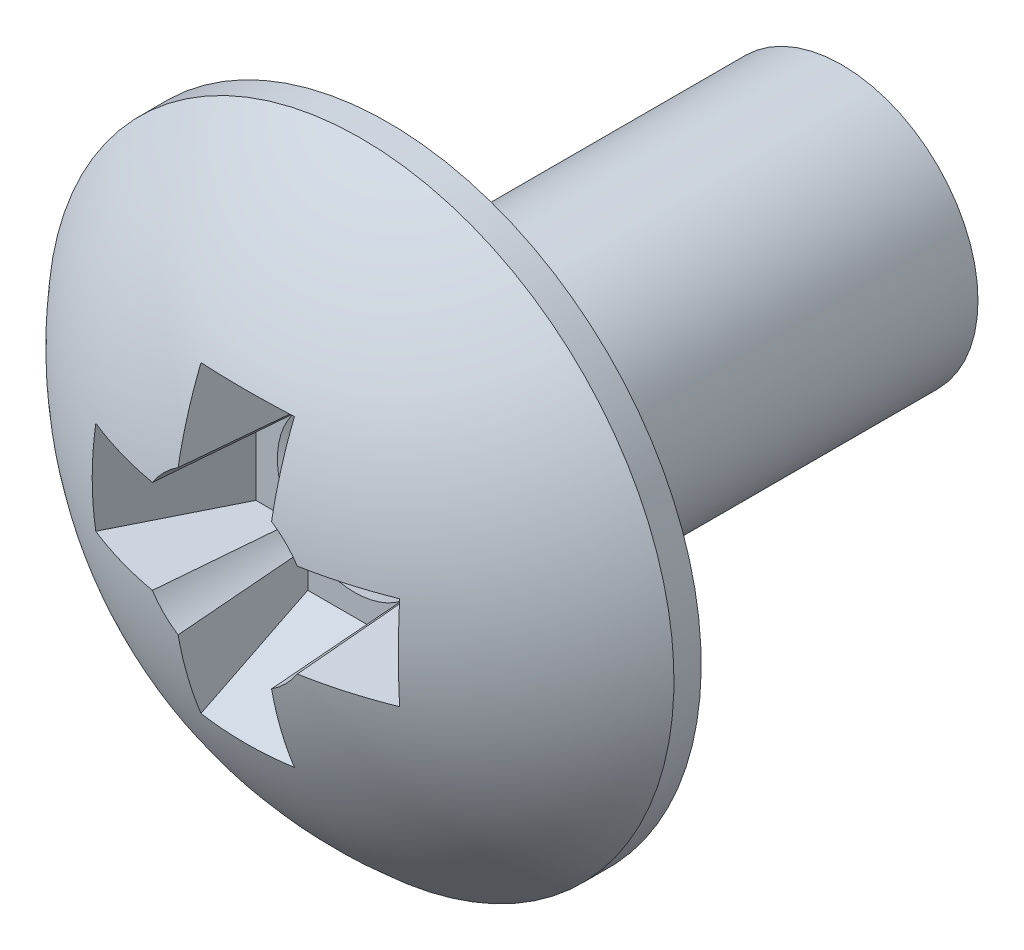
ISO-10303-21;
HEADER;
FILE_DESCRIPTION(('STEP AP214'),'2;1');
FILE_NAME('part.step','',(''),(''),'','','');
FILE_SCHEMA(('AUTOMOTIVE_DESIGN { 1 0 10303 214 1 1 1 1 }'));
ENDSEC;
DATA;
#1=APPLICATION_CONTEXT('core data for automotive mechanical design processes');
#2=APPLICATION_PROTOCOL_DEFINITION('international standard','automotive_design',2000,#1);
#3=PRODUCT_CONTEXT('',#1,'mechanical');
#4=PRODUCT('Part','Part','',(#3));
#5=PRODUCT_RELATED_PRODUCT_CATEGORY('part','',(#4));
#6=PRODUCT_DEFINITION_FORMATION('','',#4);
#7=PRODUCT_DEFINITION_CONTEXT('part definition',#1,'design');
#8=PRODUCT_DEFINITION('design','',#6,#7);
#9=PRODUCT_DEFINITION_SHAPE('','',#8);
#10=(LENGTH_UNIT() NAMED_UNIT(*) SI_UNIT(.MILLI.,.METRE.));
#11=(NAMED_UNIT(*) PLANE_ANGLE_UNIT() SI_UNIT($,.RADIAN.));
#12=(NAMED_UNIT(*) SI_UNIT($,.STERADIAN.) SOLID_ANGLE_UNIT());
#13=UNCERTAINTY_MEASURE_WITH_UNIT(LENGTH_MEASURE(1.E-05),#10,'distance_accuracy_value','');
#14=(GEOMETRIC_REPRESENTATION_CONTEXT(3) GLOBAL_UNCERTAINTY_ASSIGNED_CONTEXT((#13)) GLOBAL_UNIT_ASSIGNED_CONTEXT((#10,
#11,#12)) REPRESENTATION_CONTEXT('',''));
#15=CARTESIAN_POINT('',(0.,0.,0.));
#16=DIRECTION('',(0.,0.,1.));
#17=DIRECTION('',(1.,0.,0.));
#18=AXIS2_PLACEMENT_3D('',#15,#16,#17);
#19=CARTESIAN_POINT('',(0.515,1.087,0.369999999999995));
#20=DIRECTION('',(0.,0.,-1.));
#21=DIRECTION('',(-1.,0.,0.));
#22=AXIS2_PLACEMENT_3D('',#19,#20,#21);
#23=PLANE('',#22);
#24=CARTESIAN_POINT('',(-0.515,1.087,0.369999999999995));
#25=DIRECTION('',(0.,-1.,0.));
#26=VECTOR('',#25,1.);
#27=LINE('',#24,#26);
#28=CARTESIAN_POINT('',(-0.515,1.087,0.369999999999995));
#29=VERTEX_POINT('',#28);
#30=CARTESIAN_POINT('',(-0.515,0.676221117682669,0.369999999999995));
#31=VERTEX_POINT('',#30);
#32=EDGE_CURVE('E527',#29,#31,#27,.T.);
#33=ORIENTED_EDGE('',*,*,#32,.T.);
#34=CARTESIAN_POINT('',(0.,0.,0.369999999999994));
#35=DIRECTION('',(0.,0.,-1.));
#36=DIRECTION('',(0.,1.,0.));
#37=AXIS2_PLACEMENT_3D('',#34,#35,#36);
#38=CIRCLE('',#37,0.85);
#39=CARTESIAN_POINT('',(0.515,0.676221117682669,0.369999999999995));
#40=VERTEX_POINT('',#39);
#41=EDGE_CURVE('E753',#31,#40,#38,.T.);
#42=ORIENTED_EDGE('',*,*,#41,.T.);
#43=CARTESIAN_POINT('',(0.515,0.676221117682669,0.369999999999995));
#44=DIRECTION('',(0.,1.,0.));
#45=VECTOR('',#44,1.);
#46=LINE('',#43,#45);
#47=CARTESIAN_POINT('',(0.515,1.087,0.369999999999995));
#48=VERTEX_POINT('',#47);
#49=EDGE_CURVE('E210',#40,#48,#46,.T.);
#50=ORIENTED_EDGE('',*,*,#49,.T.);
#51=CARTESIAN_POINT('',(0.515,1.087,0.369999999999995));
#52=DIRECTION('',(-1.,0.,0.));
#53=VECTOR('',#52,1.);
#54=LINE('',#51,#53);
#55=EDGE_CURVE('E209',#48,#29,#54,.T.);
#56=ORIENTED_EDGE('',*,*,#55,.T.);
#57=EDGE_LOOP('',(#33,#42,#50,#56));
#58=FACE_BOUND('',#57,.T.);
#59=ADVANCED_FACE('F17',(#58),#23,.F.);
#60=CARTESIAN_POINT('',(1.087,0.515,0.369999999999995));
#61=DIRECTION('',(-1.,0.,0.));
#62=VECTOR('',#61,1.);
#63=LINE('',#60,#62);
#64=CARTESIAN_POINT('',(1.087,0.515,0.369999999999995));
#65=VERTEX_POINT('',#64);
#66=CARTESIAN_POINT('',(0.676221117682691,0.515,0.369999999999995));
#67=VERTEX_POINT('',#66);
#68=EDGE_CURVE('E454',#65,#67,#63,.T.);
#69=ORIENTED_EDGE('',*,*,#68,.T.);
#70=CARTESIAN_POINT('',(0.676221117682656,-0.515,0.369999999999993));
#71=VERTEX_POINT('',#70);
#72=EDGE_CURVE('E399',#67,#71,#38,.T.);
#73=ORIENTED_EDGE('',*,*,#72,.T.);
#74=CARTESIAN_POINT('',(0.676221117682731,-0.515,0.369999999999995));
#75=DIRECTION('',(1.,0.,0.));
#76=VECTOR('',#75,1.);
#77=LINE('',#74,#76);
#78=CARTESIAN_POINT('',(1.087,-0.515,0.369999999999995));
#79=VERTEX_POINT('',#78);
#80=EDGE_CURVE('E394',#71,#79,#77,.T.);
#81=ORIENTED_EDGE('',*,*,#80,.T.);
#82=CARTESIAN_POINT('',(1.087,-0.515,0.369999999999995));
#83=DIRECTION('',(0.,1.,0.));
#84=VECTOR('',#83,1.);
#85=LINE('',#82,#84);
#86=EDGE_CURVE('E397',#79,#65,#85,.T.);
#87=ORIENTED_EDGE('',*,*,#86,.T.);
#88=EDGE_LOOP('',(#69,#73,#81,#87));
#89=FACE_BOUND('',#88,.T.);
#90=ADVANCED_FACE('F153',(#89),#23,.F.);
#91=CARTESIAN_POINT('',(0.515,-1.087,0.369999999999995));
#92=DIRECTION('',(0.,1.,0.));
#93=VECTOR('',#92,1.);
#94=LINE('',#91,#93);
#95=CARTESIAN_POINT('',(0.515,-1.087,0.369999999999995));
#96=VERTEX_POINT('',#95);
#97=CARTESIAN_POINT('',(0.515,-0.676221117682656,0.369999999999993));
#98=VERTEX_POINT('',#97);
#99=EDGE_CURVE('E198',#96,#98,#94,.T.);
#100=ORIENTED_EDGE('',*,*,#99,.T.);
#101=CARTESIAN_POINT('',(-0.515,-0.676221117682656,0.369999999999993));
#102=VERTEX_POINT('',#101);
#103=EDGE_CURVE('E200',#98,#102,#38,.T.);
#104=ORIENTED_EDGE('',*,*,#103,.T.);
#105=CARTESIAN_POINT('',(-0.515,-0.676221117682657,0.369999999999995));
#106=DIRECTION('',(0.,-1.,0.));
#107=VECTOR('',#106,1.);
#108=LINE('',#105,#107);
#109=CARTESIAN_POINT('',(-0.515,-1.087,0.369999999999995));
#110=VERTEX_POINT('',#109);
#111=EDGE_CURVE('E233',#102,#110,#108,.T.);
#112=ORIENTED_EDGE('',*,*,#111,.T.);
#113=CARTESIAN_POINT('',(-0.515,-1.087,0.369999999999995));
#114=DIRECTION('',(1.,0.,0.));
#115=VECTOR('',#114,1.);
#116=LINE('',#113,#115);
#117=EDGE_CURVE('E203',#110,#96,#116,.T.);
#118=ORIENTED_EDGE('',*,*,#117,.T.);
#119=EDGE_LOOP('',(#100,#104,#112,#118));
#120=FACE_BOUND('',#119,.T.);
#121=ADVANCED_FACE('F161',(#120),#23,.F.);
#122=CARTESIAN_POINT('',(0.,0.,-2.61953125));
#123=DIRECTION('',(0.,0.,1.));
#124=DIRECTION('',(0.,1.,0.));
#125=AXIS2_PLACEMENT_3D('',#122,#123,#124);
#126=SPHERICAL_SURFACE('',#125,4.51953125);
#127=CARTESIAN_POINT('',(0.,0.,0.3));
#128=DIRECTION('',(0.,0.,1.));
#129=DIRECTION('',(0.,-1.,0.));
#130=AXIS2_PLACEMENT_3D('',#127,#128,#129);
#131=CIRCLE('',#130,3.45);
#132=CARTESIAN_POINT('',(0.,-3.45,0.300000000000002));
#133=VERTEX_POINT('',#132);
#134=EDGE_CURVE('E219',#133,#133,#131,.T.);
#135=ORIENTED_EDGE('',*,*,#134,.T.);
#136=EDGE_LOOP('',(#135));
#137=FACE_BOUND('',#136,.T.);
#138=CARTESIAN_POINT('',(0.515,0.,-2.61953125));
#139=DIRECTION('',(-1.,0.,0.));
#140=DIRECTION('',(0.,0.,1.));
#141=AXIS2_PLACEMENT_3D('',#138,#139,#140);
#142=CIRCLE('',#141,4.49009328630559);
#143=CARTESIAN_POINT('',(0.515,0.798209878333065,1.79904303475047));
#144=VERTEX_POINT('',#143);
#145=CARTESIAN_POINT('',(0.515,1.67390201689646,1.5468808464634));
#146=VERTEX_POINT('',#145);
#147=EDGE_CURVE('E529',#144,#146,#142,.T.);
#148=ORIENTED_EDGE('',*,*,#147,.F.);
#149=CARTESIAN_POINT('',(0.,0.,1.79904303475046));
#150=DIRECTION('',(0.,0.,-1.));
#151=DIRECTION('',(0.,1.,0.));
#152=AXIS2_PLACEMENT_3D('',#149,#150,#151);
#153=CIRCLE('',#152,0.949928423550165);
#154=CARTESIAN_POINT('',(0.798209878333973,0.515,1.79904303475024));
#155=VERTEX_POINT('',#154);
#156=EDGE_CURVE('E539',#144,#155,#153,.T.);
#157=ORIENTED_EDGE('',*,*,#156,.T.);
#158=CARTESIAN_POINT('',(0.,0.515,-2.61953125));
#159=DIRECTION('',(0.,-1.,0.));
#160=DIRECTION('',(1.,0.,0.));
#161=AXIS2_PLACEMENT_3D('',#158,#159,#160);
#162=CIRCLE('',#161,4.49009328630559);
#163=CARTESIAN_POINT('',(1.67390201689646,0.514999999999994,1.5468808464634));
#164=VERTEX_POINT('',#163);
#165=EDGE_CURVE('E458',#164,#155,#162,.T.);
#166=ORIENTED_EDGE('',*,*,#165,.F.);
#167=CARTESIAN_POINT('',(-0.323423971838329,0.,-2.45824204051461));
#168=DIRECTION('',(-0.894894620172902,0.,0.446277513197336));
#169=DIRECTION('',(0.446277513197336,0.,0.894894620172902));
#170=AXIS2_PLACEMENT_3D('',#167,#168,#169);
#171=CIRCLE('',#170,4.50505776267857);
#172=CARTESIAN_POINT('',(1.67390201689646,-0.515000000000006,1.5468808464634));
#173=VERTEX_POINT('',#172);
#174=EDGE_CURVE('E27',#173,#164,#171,.T.);
#175=ORIENTED_EDGE('',*,*,#174,.F.);
#176=CARTESIAN_POINT('',(0.,-0.515,-2.61953125));
#177=DIRECTION('',(0.,1.,0.));
#178=DIRECTION('',(-1.,0.,0.));
#179=AXIS2_PLACEMENT_3D('',#176,#177,#178);
#180=CIRCLE('',#179,4.49009328630559);
#181=CARTESIAN_POINT('',(0.798209878333964,-0.515,1.79904303475024));
#182=VERTEX_POINT('',#181);
#183=EDGE_CURVE('E414',#182,#173,#180,.T.);
#184=ORIENTED_EDGE('',*,*,#183,.F.);
#185=CARTESIAN_POINT('',(0.515,-0.79820987833308,1.79904303475046));
#186=VERTEX_POINT('',#185);
#187=EDGE_CURVE('E543',#182,#186,#153,.T.);
#188=ORIENTED_EDGE('',*,*,#187,.T.);
#189=CARTESIAN_POINT('',(0.515,-1.67390201689646,1.5468808464634));
#190=VERTEX_POINT('',#189);
#191=EDGE_CURVE('E521',#190,#186,#142,.T.);
#192=ORIENTED_EDGE('',*,*,#191,.F.);
#193=CARTESIAN_POINT('',(0.,0.323423971838329,-2.45824204051461));
#194=DIRECTION('',(0.,0.894894620172902,0.446277513197336));
#195=DIRECTION('',(0.,-0.446277513197336,0.894894620172902));
#196=AXIS2_PLACEMENT_3D('',#193,#194,#195);
#197=CIRCLE('',#196,4.50505776267857);
#198=CARTESIAN_POINT('',(-0.515,-1.67390201689646,1.5468808464634));
#199=VERTEX_POINT('',#198);
#200=EDGE_CURVE('E532',#199,#190,#197,.T.);
#201=ORIENTED_EDGE('',*,*,#200,.F.);
#202=CARTESIAN_POINT('',(-0.515,0.,-2.61953125));
#203=DIRECTION('',(1.,0.,0.));
#204=DIRECTION('',(0.,0.,-1.));
#205=AXIS2_PLACEMENT_3D('',#202,#203,#204);
#206=CIRCLE('',#205,4.49009328630559);
#207=CARTESIAN_POINT('',(-0.515,-0.79820987833308,1.79904303475046));
#208=VERTEX_POINT('',#207);
#209=EDGE_CURVE('E42',#208,#199,#206,.T.);
#210=ORIENTED_EDGE('',*,*,#209,.F.);
#211=CARTESIAN_POINT('',(-0.798209878333968,-0.515,1.79904303475024));
#212=VERTEX_POINT('',#211);
#213=EDGE_CURVE('E547',#208,#212,#153,.T.);
#214=ORIENTED_EDGE('',*,*,#213,.T.);
#215=CARTESIAN_POINT('',(-1.67390201689646,-0.514999999999994,1.5468808464634));
#216=VERTEX_POINT('',#215);
#217=EDGE_CURVE('E460',#216,#212,#180,.T.);
#218=ORIENTED_EDGE('',*,*,#217,.F.);
#219=CARTESIAN_POINT('',(0.323423971838329,0.,-2.45824204051461));
#220=DIRECTION('',(0.894894620172902,0.,0.446277513197336));
#221=DIRECTION('',(0.446277513197336,0.,-0.894894620172902));
#222=AXIS2_PLACEMENT_3D('',#219,#220,#221);
#223=CIRCLE('',#222,4.50505776267857);
#224=CARTESIAN_POINT('',(-1.67390201689646,0.515000000000006,1.5468808464634));
#225=VERTEX_POINT('',#224);
#226=EDGE_CURVE('E520',#225,#216,#223,.T.);
#227=ORIENTED_EDGE('',*,*,#226,.F.);
#228=CARTESIAN_POINT('',(-0.798209878333969,0.515,1.79904303475024));
#229=VERTEX_POINT('',#228);
#230=EDGE_CURVE('E453',#229,#225,#162,.T.);
#231=ORIENTED_EDGE('',*,*,#230,.F.);
#232=CARTESIAN_POINT('',(-0.515,0.798209878333065,1.79904303475047));
#233=VERTEX_POINT('',#232);
#234=EDGE_CURVE('E528',#229,#233,#153,.T.);
#235=ORIENTED_EDGE('',*,*,#234,.T.);
#236=CARTESIAN_POINT('',(-0.515,1.67390201689646,1.5468808464634));
#237=VERTEX_POINT('',#236);
#238=EDGE_CURVE('E526',#237,#233,#206,.T.);
#239=ORIENTED_EDGE('',*,*,#238,.F.);
#240=CARTESIAN_POINT('',(0.,-0.323423971838329,-2.45824204051461));
#241=DIRECTION('',(0.,-0.894894620172902,0.446277513197336));
#242=DIRECTION('',(0.,-0.446277513197336,-0.894894620172902));
#243=AXIS2_PLACEMENT_3D('',#240,#241,#242);
#244=CIRCLE('',#243,4.50505776267857);
#245=EDGE_CURVE('E516',#146,#237,#244,.T.);
#246=ORIENTED_EDGE('',*,*,#245,.F.);
#247=EDGE_LOOP('',(#148,#157,#166,#175,#184,#188,#192,#201,#210,#214,#218,#227,#231,#235,#239,#246));
#248=FACE_BOUND('',#247,.T.);
#249=ADVANCED_FACE('F185',(#137,#248),#126,.T.);
#250=CARTESIAN_POINT('',(0.515,1.85,1.9));
#251=DIRECTION('',(-1.,0.,0.));
#252=DIRECTION('',(0.,0.,1.));
#253=AXIS2_PLACEMENT_3D('',#250,#251,#252);
#254=PLANE('',#253);
#255=CARTESIAN_POINT('',(0.515,-0.676203538203928,0.369799999999995));
#256=CARTESIAN_POINT('',(0.515,-0.686977817279436,0.492385837192164));
#257=CARTESIAN_POINT('',(0.515,-0.697659783193955,0.614979756839775));
#258=CARTESIAN_POINT('',(0.515,-0.71885996383192,0.860181586604722));
#259=CARTESIAN_POINT('',(0.515,-0.729378178783591,0.98278949670232));
#260=CARTESIAN_POINT('',(0.515,-0.750271759966733,1.22801744439974));
#261=CARTESIAN_POINT('',(0.515,-0.760647126233472,1.35063748199655));
#262=CARTESIAN_POINT('',(0.515,-0.781270880231328,1.59588840984393));
#263=CARTESIAN_POINT('',(0.515,-0.791519267785612,1.71851930010936));
#264=CARTESIAN_POINT('',(0.515,-0.801712085336819,1.8411547934041));
#265=B_SPLINE_CURVE_WITH_KNOTS('',3,(#255,#256,#257,#258,#259,#260,#261,#262,#263,#264),
.UNSPECIFIED.,.F.,.F.,(4,2,2,2,4),(0.,0.369175154160477,0.738349793739872,1.10752434216751,
1.47669940465616),.UNSPECIFIED.);
#266=EDGE_CURVE('E549',#98,#186,#265,.T.);
#267=ORIENTED_EDGE('',*,*,#266,.F.);
#268=ORIENTED_EDGE('',*,*,#99,.F.);
#269=DIRECTION('',(0.,-0.446277513197336,0.894894620172902));
#270=VECTOR('',#269,1.);
#271=CARTESIAN_POINT('',(0.515,-1.087,0.369999999999995));
#272=LINE('',#271,#270);
#273=EDGE_CURVE('E476',#96,#190,#272,.T.);
#274=ORIENTED_EDGE('',*,*,#273,.T.);
#275=ORIENTED_EDGE('',*,*,#191,.T.);
#276=EDGE_LOOP('',(#267,#268,#274,#275));
#277=FACE_BOUND('',#276,.T.);
#278=ADVANCED_FACE('F191',(#277),#254,.T.);
#279=CARTESIAN_POINT('',(0.515,0.801712085335624,1.84115479340421));
#280=CARTESIAN_POINT('',(0.515,0.79151926778513,1.71851930010941));
#281=CARTESIAN_POINT('',(0.515,0.781270880231192,1.59588840984394));
#282=CARTESIAN_POINT('',(0.515,0.760647126233626,1.35063748199654));
#283=CARTESIAN_POINT('',(0.515,0.750271759966832,1.22801744439973));
#284=CARTESIAN_POINT('',(0.515,0.729378178783512,0.982789496702331));
#285=CARTESIAN_POINT('',(0.515,0.718859963831717,0.860181586604745));
#286=CARTESIAN_POINT('',(0.515,0.69765978319418,0.614979756839762));
#287=CARTESIAN_POINT('',(0.515,0.686977817280211,0.492385837192105));
#288=CARTESIAN_POINT('',(0.515,0.676203538205961,0.369799999999827));
#289=B_SPLINE_CURVE_WITH_KNOTS('',3,(#279,#280,#281,#282,#283,#284,#285,#286,#287,#288),
.UNSPECIFIED.,.F.,.F.,(4,2,2,2,4),(0.,0.369175062488653,0.738349610916287,1.10752425049568,
1.47669940465615),.UNSPECIFIED.);
#290=EDGE_CURVE('E541',#144,#40,#289,.T.);
#291=ORIENTED_EDGE('',*,*,#290,.F.);
#292=ORIENTED_EDGE('',*,*,#147,.T.);
#293=DIRECTION('',(0.,0.446277513197336,0.894894620172902));
#294=VECTOR('',#293,1.);
#295=CARTESIAN_POINT('',(0.515,1.087,0.369999999999995));
#296=LINE('',#295,#294);
#297=EDGE_CURVE('E484',#48,#146,#296,.T.);
#298=ORIENTED_EDGE('',*,*,#297,.F.);
#299=ORIENTED_EDGE('',*,*,#49,.F.);
#300=EDGE_LOOP('',(#291,#292,#298,#299));
#301=FACE_BOUND('',#300,.T.);
#302=ADVANCED_FACE('F253',(#301),#254,.T.);
#303=CARTESIAN_POINT('',(-0.515,-1.85,1.9));
#304=DIRECTION('',(1.,0.,0.));
#305=DIRECTION('',(0.,0.,-1.));
#306=AXIS2_PLACEMENT_3D('',#303,#304,#305);
#307=PLANE('',#306);
#308=CARTESIAN_POINT('',(-0.515,-0.801712085335617,1.84115479340421));
#309=CARTESIAN_POINT('',(-0.515,-0.791519267785122,1.71851930010941));
#310=CARTESIAN_POINT('',(-0.515,-0.781270880231184,1.59588840984395));
#311=CARTESIAN_POINT('',(-0.515,-0.760647126233617,1.35063748199654));
#312=CARTESIAN_POINT('',(-0.515,-0.750271759966822,1.22801744439973));
#313=CARTESIAN_POINT('',(-0.515,-0.729378178783502,0.982789496702331));
#314=CARTESIAN_POINT('',(-0.515,-0.718859963831706,0.860181586604745));
#315=CARTESIAN_POINT('',(-0.515,-0.697659783194169,0.614979756839762));
#316=CARTESIAN_POINT('',(-0.515,-0.686977817280199,0.492385837192104));
#317=CARTESIAN_POINT('',(-0.515,-0.676203538205949,0.369799999999827));
#318=B_SPLINE_CURVE_WITH_KNOTS('',3,(#308,#309,#310,#311,#312,#313,#314,#315,#316,#317),
.UNSPECIFIED.,.F.,.F.,(4,2,2,2,4),(0.,0.369175062488653,0.738349610916287,1.10752425049568,
1.47669940465616),.UNSPECIFIED.);
#319=EDGE_CURVE('E266',#208,#102,#318,.T.);
#320=ORIENTED_EDGE('',*,*,#319,.F.);
#321=ORIENTED_EDGE('',*,*,#209,.T.);
#322=DIRECTION('',(0.,-0.446277513197336,0.894894620172902));
#323=VECTOR('',#322,1.);
#324=CARTESIAN_POINT('',(-0.515,-1.087,0.369999999999995));
#325=LINE('',#324,#323);
#326=EDGE_CURVE('E468',#110,#199,#325,.T.);
#327=ORIENTED_EDGE('',*,*,#326,.F.);
#328=ORIENTED_EDGE('',*,*,#111,.F.);
#329=EDGE_LOOP('',(#320,#321,#327,#328));
#330=FACE_BOUND('',#329,.T.);
#331=ADVANCED_FACE('F243',(#330),#307,.T.);
#332=CARTESIAN_POINT('',(-0.515,0.67620353820394,0.369799999999995));
#333=CARTESIAN_POINT('',(-0.515,0.686977817279448,0.492385837192164));
#334=CARTESIAN_POINT('',(-0.515,0.697659783193966,0.614979756839775));
#335=CARTESIAN_POINT('',(-0.515,0.71885996383193,0.860181586604722));
#336=CARTESIAN_POINT('',(-0.515,0.729378178783601,0.98278949670232));
#337=CARTESIAN_POINT('',(-0.515,0.750271759966742,1.22801744439974));
#338=CARTESIAN_POINT('',(-0.515,0.760647126233481,1.35063748199655));
#339=CARTESIAN_POINT('',(-0.515,0.781270880231336,1.59588840984393));
#340=CARTESIAN_POINT('',(-0.515,0.79151926778562,1.71851930010936));
#341=CARTESIAN_POINT('',(-0.515,0.801712085336827,1.8411547934041));
#342=B_SPLINE_CURVE_WITH_KNOTS('',3,(#332,#333,#334,#335,#336,#337,#338,#339,#340,#341),
.UNSPECIFIED.,.F.,.F.,(4,2,2,2,4),(0.,0.369175154160477,0.738349793739872,1.10752434216751,
1.47669940465616),.UNSPECIFIED.);
#343=EDGE_CURVE('E313',#31,#233,#342,.T.);
#344=ORIENTED_EDGE('',*,*,#343,.F.);
#345=ORIENTED_EDGE('',*,*,#32,.F.);
#346=DIRECTION('',(0.,0.446277513197336,0.894894620172902));
#347=VECTOR('',#346,1.);
#348=CARTESIAN_POINT('',(-0.515,1.087,0.369999999999995));
#349=LINE('',#348,#347);
#350=EDGE_CURVE('E475',#29,#237,#349,.T.);
#351=ORIENTED_EDGE('',*,*,#350,.T.);
#352=ORIENTED_EDGE('',*,*,#238,.T.);
#353=EDGE_LOOP('',(#344,#345,#351,#352));
#354=FACE_BOUND('',#353,.T.);
#355=ADVANCED_FACE('F252',(#354),#307,.T.);
#356=CARTESIAN_POINT('',(0.,0.,-5.));
#357=DIRECTION('',(0.,0.,1.));
#358=DIRECTION('',(0.,-1.,0.));
#359=AXIS2_PLACEMENT_3D('',#356,#357,#358);
#360=PLANE('',#359);
#361=CARTESIAN_POINT('',(0.,0.,-5.));
#362=DIRECTION('',(0.,0.,1.));
#363=DIRECTION('',(0.,-1.,0.));
#364=AXIS2_PLACEMENT_3D('',#361,#362,#363);
#365=CIRCLE('',#364,1.5);
#366=CARTESIAN_POINT('',(0.,-1.5,-5.));
#367=VERTEX_POINT('',#366);
#368=EDGE_CURVE('E773',#367,#367,#365,.T.);
#369=ORIENTED_EDGE('',*,*,#368,.F.);
#370=EDGE_LOOP('',(#369));
#371=FACE_BOUND('',#370,.T.);
#372=ADVANCED_FACE('F653',(#371),#360,.F.);
#373=CARTESIAN_POINT('',(0.,0.,1.9));
#374=DIRECTION('',(0.,0.,1.));
#375=DIRECTION('',(0.,-1.,0.));
#376=AXIS2_PLACEMENT_3D('',#373,#374,#375);
#377=CYLINDRICAL_SURFACE('',#376,1.5);
#378=CARTESIAN_POINT('',(0.,0.,-0.0999999999999985));
#379=DIRECTION('',(0.,0.,1.));
#380=DIRECTION('',(0.,-1.,0.));
#381=AXIS2_PLACEMENT_3D('',#378,#379,#380);
#382=CIRCLE('',#381,1.5);
#383=CARTESIAN_POINT('',(0.,-1.5,-0.0999999999999977));
#384=VERTEX_POINT('',#383);
#385=EDGE_CURVE('E781',#384,#384,#382,.F.);
#386=ORIENTED_EDGE('',*,*,#385,.T.);
#387=EDGE_LOOP('',(#386));
#388=FACE_BOUND('',#387,.T.);
#389=ORIENTED_EDGE('',*,*,#368,.T.);
#390=EDGE_LOOP('',(#389));
#391=FACE_BOUND('',#390,.T.);
#392=ADVANCED_FACE('F642',(#388,#391),#377,.T.);
#393=CARTESIAN_POINT('',(0.,1.5,0.));
#394=DIRECTION('',(0.,0.,1.));
#395=DIRECTION('',(0.,-1.,0.));
#396=AXIS2_PLACEMENT_3D('',#393,#394,#395);
#397=PLANE('',#396);
#398=CARTESIAN_POINT('',(0.,0.,0.));
#399=DIRECTION('',(0.,0.,1.));
#400=DIRECTION('',(0.,-1.,0.));
#401=AXIS2_PLACEMENT_3D('',#398,#399,#400);
#402=CIRCLE('',#401,1.6);
#403=CARTESIAN_POINT('',(0.,-1.6,0.));
#404=VERTEX_POINT('',#403);
#405=EDGE_CURVE('E777',#404,#404,#402,.T.);
#406=ORIENTED_EDGE('',*,*,#405,.T.);
#407=EDGE_LOOP('',(#406));
#408=FACE_BOUND('',#407,.T.);
#409=CARTESIAN_POINT('',(0.,0.,0.));
#410=DIRECTION('',(0.,0.,1.));
#411=DIRECTION('',(0.,-1.,0.));
#412=AXIS2_PLACEMENT_3D('',#409,#410,#411);
#413=CIRCLE('',#412,3.45);
#414=CARTESIAN_POINT('',(0.,-3.45,0.));
#415=VERTEX_POINT('',#414);
#416=EDGE_CURVE('E770',#415,#415,#413,.T.);
#417=ORIENTED_EDGE('',*,*,#416,.F.);
#418=EDGE_LOOP('',(#417));
#419=FACE_BOUND('',#418,.T.);
#420=ADVANCED_FACE('F631',(#408,#419),#397,.F.);
#421=CARTESIAN_POINT('',(0.,0.,1.9));
#422=DIRECTION('',(0.,0.,1.));
#423=DIRECTION('',(0.,-1.,0.));
#424=AXIS2_PLACEMENT_3D('',#421,#422,#423);
#425=CYLINDRICAL_SURFACE('',#424,3.45);
#426=ORIENTED_EDGE('',*,*,#134,.F.);
#427=EDGE_LOOP('',(#426));
#428=FACE_BOUND('',#427,.T.);
#429=ORIENTED_EDGE('',*,*,#416,.T.);
#430=EDGE_LOOP('',(#429));
#431=FACE_BOUND('',#430,.T.);
#432=ADVANCED_FACE('F513',(#428,#431),#425,.T.);
#433=CARTESIAN_POINT('',(0.,0.,-0.0999999999999985));
#434=DIRECTION('',(0.,0.,1.));
#435=DIRECTION('',(0.,-1.,0.));
#436=AXIS2_PLACEMENT_3D('',#433,#434,#435);
#437=TOROIDAL_SURFACE('',#436,1.6,0.1);
#438=ORIENTED_EDGE('',*,*,#385,.F.);
#439=EDGE_LOOP('',(#438));
#440=FACE_BOUND('',#439,.T.);
#441=ORIENTED_EDGE('',*,*,#405,.F.);
#442=EDGE_LOOP('',(#441));
#443=FACE_BOUND('',#442,.T.);
#444=ADVANCED_FACE('F19',(#440,#443),#437,.F.);
#445=CARTESIAN_POINT('',(-0.515,1.85,1.9));
#446=DIRECTION('',(0.,-0.894894620172902,0.446277513197336));
#447=DIRECTION('',(0.,-0.446277513197336,-0.894894620172902));
#448=AXIS2_PLACEMENT_3D('',#445,#446,#447);
#449=PLANE('',#448);
#450=ORIENTED_EDGE('',*,*,#245,.T.);
#451=ORIENTED_EDGE('',*,*,#350,.F.);
#452=ORIENTED_EDGE('',*,*,#55,.F.);
#453=ORIENTED_EDGE('',*,*,#297,.T.);
#454=EDGE_LOOP('',(#450,#451,#452,#453));
#455=FACE_BOUND('',#454,.T.);
#456=ADVANCED_FACE('F180',(#455),#449,.T.);
#457=CARTESIAN_POINT('',(0.515,-1.85,1.9));
#458=DIRECTION('',(0.,0.894894620172902,0.446277513197336));
#459=DIRECTION('',(0.,-0.446277513197336,0.894894620172902));
#460=AXIS2_PLACEMENT_3D('',#457,#458,#459);
#461=PLANE('',#460);
#462=ORIENTED_EDGE('',*,*,#200,.T.);
#463=ORIENTED_EDGE('',*,*,#273,.F.);
#464=ORIENTED_EDGE('',*,*,#117,.F.);
#465=ORIENTED_EDGE('',*,*,#326,.T.);
#466=EDGE_LOOP('',(#462,#463,#464,#465));
#467=FACE_BOUND('',#466,.T.);
#468=ADVANCED_FACE('F169',(#467),#461,.T.);
#469=CARTESIAN_POINT('',(-1.087,-0.515,0.369999999999995));
#470=DIRECTION('',(1.,0.,0.));
#471=VECTOR('',#470,1.);
#472=LINE('',#469,#471);
#473=CARTESIAN_POINT('',(-1.087,-0.515,0.369999999999995));
#474=VERTEX_POINT('',#473);
#475=CARTESIAN_POINT('',(-0.67622111768266,-0.515,0.369999999999993));
#476=VERTEX_POINT('',#475);
#477=EDGE_CURVE('E374',#474,#476,#472,.T.);
#478=ORIENTED_EDGE('',*,*,#477,.T.);
#479=CARTESIAN_POINT('',(-0.676221117682666,0.515,0.369999999999995));
#480=VERTEX_POINT('',#479);
#481=EDGE_CURVE('E802',#476,#480,#38,.T.);
#482=ORIENTED_EDGE('',*,*,#481,.T.);
#483=CARTESIAN_POINT('',(-0.67622111768274,0.515,0.369999999999995));
#484=DIRECTION('',(-1.,0.,0.));
#485=VECTOR('',#484,1.);
#486=LINE('',#483,#485);
#487=CARTESIAN_POINT('',(-1.087,0.515,0.369999999999995));
#488=VERTEX_POINT('',#487);
#489=EDGE_CURVE('E347',#480,#488,#486,.T.);
#490=ORIENTED_EDGE('',*,*,#489,.T.);
#491=CARTESIAN_POINT('',(-1.087,0.515,0.369999999999995));
#492=DIRECTION('',(0.,-1.,0.));
#493=VECTOR('',#492,1.);
#494=LINE('',#491,#493);
#495=EDGE_CURVE('E363',#488,#474,#494,.T.);
#496=ORIENTED_EDGE('',*,*,#495,.T.);
#497=EDGE_LOOP('',(#478,#482,#490,#496));
#498=FACE_BOUND('',#497,.T.);
#499=ADVANCED_FACE('F156',(#498),#23,.F.);
#500=CARTESIAN_POINT('',(-1.85,0.515000000000006,1.9));
#501=DIRECTION('',(0.,-1.,0.));
#502=DIRECTION('',(0.,0.,-1.));
#503=AXIS2_PLACEMENT_3D('',#500,#501,#502);
#504=PLANE('',#503);
#505=CARTESIAN_POINT('',(-0.801712085335621,0.515,1.84115479340421));
#506=CARTESIAN_POINT('',(-0.791519267785127,0.515000000000002,1.71851930010941));
#507=CARTESIAN_POINT('',(-0.781270880231189,0.515000000000002,1.59588840984394));
#508=CARTESIAN_POINT('',(-0.760647126233623,0.515000000000003,1.35063748199654));
#509=CARTESIAN_POINT('',(-0.750271759966829,0.515000000000002,1.22801744439973));
#510=CARTESIAN_POINT('',(-0.729378178783509,0.515000000000002,0.982789496702331));
#511=CARTESIAN_POINT('',(-0.718859963831714,0.515000000000003,0.860181586604745));
#512=CARTESIAN_POINT('',(-0.697659783194177,0.515000000000002,0.614979756839762));
#513=CARTESIAN_POINT('',(-0.686977817280208,0.515000000000002,0.492385837192105));
#514=CARTESIAN_POINT('',(-0.676203538205958,0.515,0.369799999999827));
#515=B_SPLINE_CURVE_WITH_KNOTS('',3,(#505,#506,#507,#508,#509,#510,#511,#512,#513,#514),
.UNSPECIFIED.,.F.,.F.,(4,2,2,2,4),(0.,0.369175062488653,0.738349610916287,1.10752425049568,
1.47669940465615),.UNSPECIFIED.);
#516=EDGE_CURVE('E268',#229,#480,#515,.T.);
#517=ORIENTED_EDGE('',*,*,#516,.F.);
#518=ORIENTED_EDGE('',*,*,#230,.T.);
#519=DIRECTION('',(-0.446277513197336,0.,0.894894620172902));
#520=VECTOR('',#519,1.);
#521=CARTESIAN_POINT('',(-1.087,0.515,0.369999999999995));
#522=LINE('',#521,#520);
#523=EDGE_CURVE('E416',#488,#225,#522,.T.);
#524=ORIENTED_EDGE('',*,*,#523,.F.);
#525=ORIENTED_EDGE('',*,*,#489,.F.);
#526=EDGE_LOOP('',(#517,#518,#524,#525));
#527=FACE_BOUND('',#526,.T.);
#528=ADVANCED_FACE('F168',(#527),#504,.T.);
#529=CARTESIAN_POINT('',(1.85,-0.515000000000007,1.9));
#530=DIRECTION('',(0.,1.,0.));
#531=DIRECTION('',(0.,0.,1.));
#532=AXIS2_PLACEMENT_3D('',#529,#530,#531);
#533=PLANE('',#532);
#534=CARTESIAN_POINT('',(-0.676203538203931,-0.515,0.369799999999995));
#535=CARTESIAN_POINT('',(-0.686977817279439,-0.514999999999999,0.492385837192164));
#536=CARTESIAN_POINT('',(-0.697659783193958,-0.514999999999998,0.614979756839775));
#537=CARTESIAN_POINT('',(-0.718859963831922,-0.514999999999998,0.860181586604722));
#538=CARTESIAN_POINT('',(-0.729378178783594,-0.514999999999998,0.98278949670232));
#539=CARTESIAN_POINT('',(-0.750271759966736,-0.514999999999998,1.22801744439974));
#540=CARTESIAN_POINT('',(-0.760647126233475,-0.514999999999998,1.35063748199655));
#541=CARTESIAN_POINT('',(-0.781270880231331,-0.514999999999998,1.59588840984393));
#542=CARTESIAN_POINT('',(-0.791519267785615,-0.514999999999999,1.71851930010936));
#543=CARTESIAN_POINT('',(-0.801712085336823,-0.515,1.8411547934041));
#544=B_SPLINE_CURVE_WITH_KNOTS('',3,(#534,#535,#536,#537,#538,#539,#540,#541,#542,#543),
.UNSPECIFIED.,.F.,.F.,(4,2,2,2,4),(0.,0.369175154160477,0.738349793739872,1.10752434216751,
1.47669940465616),.UNSPECIFIED.);
#545=EDGE_CURVE('E551',#476,#212,#544,.T.);
#546=ORIENTED_EDGE('',*,*,#545,.F.);
#547=ORIENTED_EDGE('',*,*,#477,.F.);
#548=DIRECTION('',(-0.446277513197336,0.,0.894894620172902));
#549=VECTOR('',#548,1.);
#550=CARTESIAN_POINT('',(-1.087,-0.515,0.369999999999995));
#551=LINE('',#550,#549);
#552=EDGE_CURVE('E433',#474,#216,#551,.T.);
#553=ORIENTED_EDGE('',*,*,#552,.T.);
#554=ORIENTED_EDGE('',*,*,#217,.T.);
#555=EDGE_LOOP('',(#546,#547,#553,#554));
#556=FACE_BOUND('',#555,.T.);
#557=ADVANCED_FACE('F176',(#556),#533,.T.);
#558=CARTESIAN_POINT('',(-1.85,-0.514999999999994,1.9));
#559=DIRECTION('',(0.894894620172902,0.,0.446277513197336));
#560=DIRECTION('',(-0.446277513197336,0.,0.894894620172902));
#561=AXIS2_PLACEMENT_3D('',#558,#559,#560);
#562=PLANE('',#561);
#563=ORIENTED_EDGE('',*,*,#226,.T.);
#564=ORIENTED_EDGE('',*,*,#552,.F.);
#565=ORIENTED_EDGE('',*,*,#495,.F.);
#566=ORIENTED_EDGE('',*,*,#523,.T.);
#567=EDGE_LOOP('',(#563,#564,#565,#566));
#568=FACE_BOUND('',#567,.T.);
#569=ADVANCED_FACE('F319',(#568),#562,.T.);
#570=CARTESIAN_POINT('',(1.85,0.514999999999993,1.9));
#571=DIRECTION('',(-0.894894620172902,0.,0.446277513197336));
#572=DIRECTION('',(-0.446277513197336,0.,-0.894894620172902));
#573=AXIS2_PLACEMENT_3D('',#570,#571,#572);
#574=PLANE('',#573);
#575=ORIENTED_EDGE('',*,*,#174,.T.);
#576=DIRECTION('',(0.446277513197336,0.,0.894894620172902));
#577=VECTOR('',#576,1.);
#578=CARTESIAN_POINT('',(1.087,0.515,0.369999999999995));
#579=LINE('',#578,#577);
#580=EDGE_CURVE('E410',#65,#164,#579,.T.);
#581=ORIENTED_EDGE('',*,*,#580,.F.);
#582=ORIENTED_EDGE('',*,*,#86,.F.);
#583=DIRECTION('',(0.446277513197336,0.,0.894894620172902));
#584=VECTOR('',#583,1.);
#585=CARTESIAN_POINT('',(1.087,-0.515,0.369999999999995));
#586=LINE('',#585,#584);
#587=EDGE_CURVE('E403',#79,#173,#586,.T.);
#588=ORIENTED_EDGE('',*,*,#587,.T.);
#589=EDGE_LOOP('',(#575,#581,#582,#588));
#590=FACE_BOUND('',#589,.T.);
#591=ADVANCED_FACE('F407',(#590),#574,.T.);
#592=CARTESIAN_POINT('',(0.801712085335616,-0.515,1.84115479340421));
#593=CARTESIAN_POINT('',(0.791519267785121,-0.515000000000002,1.71851930010941));
#594=CARTESIAN_POINT('',(0.781270880231183,-0.515000000000003,1.59588840984395));
#595=CARTESIAN_POINT('',(0.760647126233617,-0.515000000000004,1.35063748199654));
#596=CARTESIAN_POINT('',(0.750271759966822,-0.515000000000003,1.22801744439973));
#597=CARTESIAN_POINT('',(0.729378178783501,-0.515000000000003,0.982789496702332));
#598=CARTESIAN_POINT('',(0.718859963831706,-0.515000000000003,0.860181586604745));
#599=CARTESIAN_POINT('',(0.697659783194168,-0.515000000000003,0.614979756839762));
#600=CARTESIAN_POINT('',(0.686977817280199,-0.515000000000002,0.492385837192105));
#601=CARTESIAN_POINT('',(0.676203538205948,-0.515,0.369799999999827));
#602=B_SPLINE_CURVE_WITH_KNOTS('',3,(#592,#593,#594,#595,#596,#597,#598,#599,#600,#601),
.UNSPECIFIED.,.F.,.F.,(4,2,2,2,4),(0.,0.369175062488653,0.738349610916287,1.10752425049568,
1.47669940465615),.UNSPECIFIED.);
#603=EDGE_CURVE('E544',#182,#71,#602,.T.);
#604=ORIENTED_EDGE('',*,*,#603,.F.);
#605=ORIENTED_EDGE('',*,*,#183,.T.);
#606=ORIENTED_EDGE('',*,*,#587,.F.);
#607=ORIENTED_EDGE('',*,*,#80,.F.);
#608=EDGE_LOOP('',(#604,#605,#606,#607));
#609=FACE_BOUND('',#608,.T.);
#610=ADVANCED_FACE('F316',(#609),#533,.T.);
#611=CARTESIAN_POINT('',(0.67620353820394,0.515,0.369799999999995));
#612=CARTESIAN_POINT('',(0.686977817279448,0.514999999999998,0.492385837192164));
#613=CARTESIAN_POINT('',(0.697659783193967,0.514999999999998,0.614979756839775));
#614=CARTESIAN_POINT('',(0.718859963831931,0.514999999999997,0.860181586604722));
#615=CARTESIAN_POINT('',(0.729378178783602,0.514999999999997,0.98278949670232));
#616=CARTESIAN_POINT('',(0.750271759966743,0.514999999999997,1.22801744439974));
#617=CARTESIAN_POINT('',(0.760647126233482,0.514999999999997,1.35063748199655));
#618=CARTESIAN_POINT('',(0.781270880231337,0.514999999999997,1.59588840984393));
#619=CARTESIAN_POINT('',(0.79151926778562,0.514999999999998,1.71851930010936));
#620=CARTESIAN_POINT('',(0.801712085336827,0.515,1.8411547934041));
#621=B_SPLINE_CURVE_WITH_KNOTS('',3,(#611,#612,#613,#614,#615,#616,#617,#618,#619,#620),
.UNSPECIFIED.,.F.,.F.,(4,2,2,2,4),(0.,0.369175154160477,0.738349793739872,1.10752434216751,
1.47669940465616),.UNSPECIFIED.);
#622=EDGE_CURVE('E11',#67,#155,#621,.T.);
#623=ORIENTED_EDGE('',*,*,#622,.F.);
#624=ORIENTED_EDGE('',*,*,#68,.F.);
#625=ORIENTED_EDGE('',*,*,#580,.T.);
#626=ORIENTED_EDGE('',*,*,#165,.T.);
#627=EDGE_LOOP('',(#623,#624,#625,#626));
#628=FACE_BOUND('',#627,.T.);
#629=ADVANCED_FACE('F179',(#628),#504,.T.);
#630=CARTESIAN_POINT('',(0.,0.,0.369999999999994));
#631=DIRECTION('',(0.,0.,1.));
#632=DIRECTION('',(0.,-1.,0.));
#633=AXIS2_PLACEMENT_3D('',#630,#631,#632);
#634=CONICAL_SURFACE('',#633,0.85,0.0698131700797676);
#635=ORIENTED_EDGE('',*,*,#343,.T.);
#636=ORIENTED_EDGE('',*,*,#234,.F.);
#637=ORIENTED_EDGE('',*,*,#516,.T.);
#638=EDGE_CURVE('E751',#480,#31,#38,.T.);
#639=ORIENTED_EDGE('',*,*,#638,.T.);
#640=EDGE_LOOP('',(#635,#636,#637,#639));
#641=FACE_BOUND('',#640,.T.);
#642=ADVANCED_FACE('F148',(#641),#634,.F.);
#643=ORIENTED_EDGE('',*,*,#319,.T.);
#644=EDGE_CURVE('E557',#102,#476,#38,.T.);
#645=ORIENTED_EDGE('',*,*,#644,.T.);
#646=ORIENTED_EDGE('',*,*,#545,.T.);
#647=ORIENTED_EDGE('',*,*,#213,.F.);
#648=EDGE_LOOP('',(#643,#645,#646,#647));
#649=FACE_BOUND('',#648,.T.);
#650=ADVANCED_FACE('F149',(#649),#634,.F.);
#651=ORIENTED_EDGE('',*,*,#266,.T.);
#652=ORIENTED_EDGE('',*,*,#187,.F.);
#653=ORIENTED_EDGE('',*,*,#603,.T.);
#654=EDGE_CURVE('E787',#71,#98,#38,.T.);
#655=ORIENTED_EDGE('',*,*,#654,.T.);
#656=EDGE_LOOP('',(#651,#652,#653,#655));
#657=FACE_BOUND('',#656,.T.);
#658=ADVANCED_FACE('F138',(#657),#634,.F.);
#659=CARTESIAN_POINT('',(0.,0.,0.0938182582020319));
#660=DIRECTION('',(0.,0.,1.));
#661=DIRECTION('',(0.,-1.,0.));
#662=AXIS2_PLACEMENT_3D('',#659,#660,#661);
#663=CONICAL_SURFACE('',#662,0.,1.25663706143592);
#664=EDGE_CURVE('E34',#40,#67,#38,.T.);
#665=ORIENTED_EDGE('',*,*,#664,.F.);
#666=ORIENTED_EDGE('',*,*,#41,.F.);
#667=ORIENTED_EDGE('',*,*,#638,.F.);
#668=ORIENTED_EDGE('',*,*,#481,.F.);
#669=ORIENTED_EDGE('',*,*,#644,.F.);
#670=ORIENTED_EDGE('',*,*,#103,.F.);
#671=ORIENTED_EDGE('',*,*,#654,.F.);
#672=ORIENTED_EDGE('',*,*,#72,.F.);
#673=EDGE_LOOP('',(#665,#666,#667,#668,#669,#670,#671,#672));
#674=FACE_BOUND('',#673,.T.);
#675=CARTESIAN_POINT('',(0.,0.,0.0938182582020319));
#676=VERTEX_POINT('',#675);
#677=VERTEX_LOOP('',#676);
#678=FACE_BOUND('',#677,.T.);
#679=ADVANCED_FACE('F135',(#674,#678),#663,.F.);
#680=ORIENTED_EDGE('',*,*,#290,.T.);
#681=ORIENTED_EDGE('',*,*,#664,.T.);
#682=ORIENTED_EDGE('',*,*,#622,.T.);
#683=ORIENTED_EDGE('',*,*,#156,.F.);
#684=EDGE_LOOP('',(#680,#681,#682,#683));
#685=FACE_BOUND('',#684,.T.);
#686=ADVANCED_FACE('F137',(#685),#634,.F.);
#687=CLOSED_SHELL('',(#59,#90,#121,#249,#278,#302,#331,#355,#372,#392,#420,#432,#444,#456,#468,
#499,#528,#557,#569,#591,#610,#629,#642,#650,#658,#679,#686));
#688=MANIFOLD_SOLID_BREP('B1',#687);
#689=ADVANCED_BREP_SHAPE_REPRESENTATION('',(#18,#688),#14);
#690=SHAPE_DEFINITION_REPRESENTATION(#9,#689);
ENDSEC;
END-ISO-10303-21;
